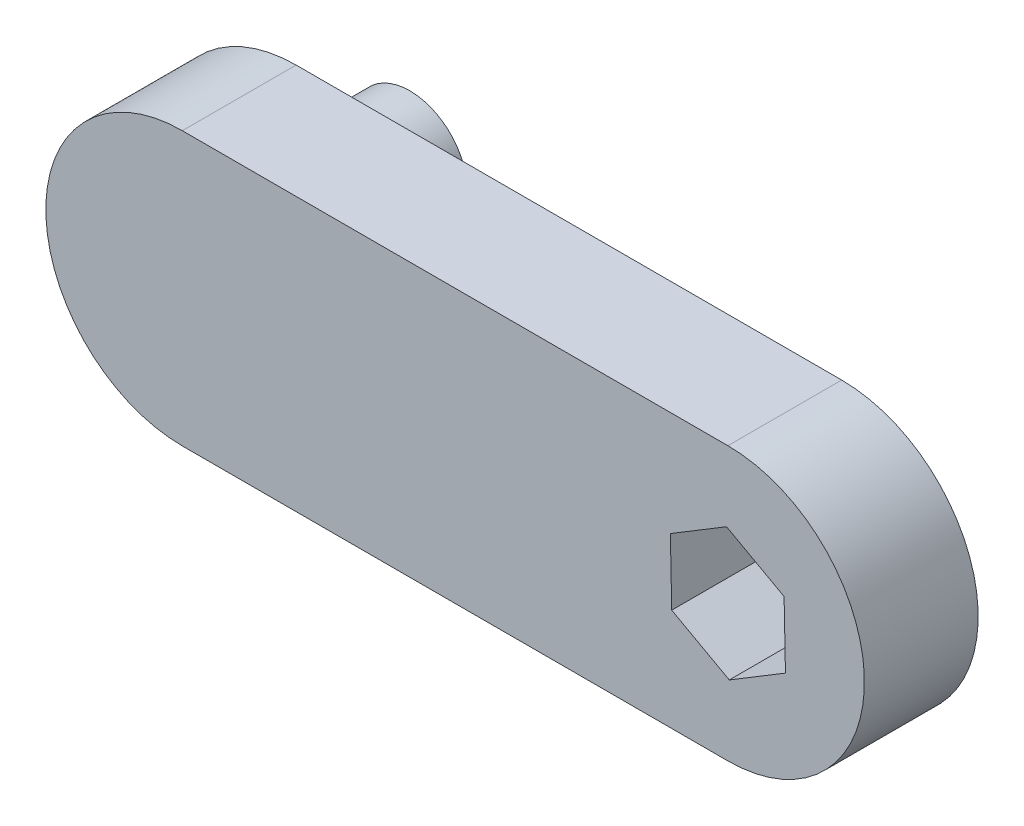
ISO-10303-21;
HEADER;
FILE_DESCRIPTION(('STEP AP214'),'2;1');
FILE_NAME('part.step','',(''),(''),'','','');
FILE_SCHEMA(('AUTOMOTIVE_DESIGN { 1 0 10303 214 1 1 1 1 }'));
ENDSEC;
DATA;
#1=APPLICATION_CONTEXT('core data for automotive mechanical design processes');
#2=APPLICATION_PROTOCOL_DEFINITION('international standard','automotive_design',2000,#1);
#3=PRODUCT_CONTEXT('',#1,'mechanical');
#4=PRODUCT('Part','Part','',(#3));
#5=PRODUCT_RELATED_PRODUCT_CATEGORY('part','',(#4));
#6=PRODUCT_DEFINITION_FORMATION('','',#4);
#7=PRODUCT_DEFINITION_CONTEXT('part definition',#1,'design');
#8=PRODUCT_DEFINITION('design','',#6,#7);
#9=PRODUCT_DEFINITION_SHAPE('','',#8);
#10=(LENGTH_UNIT() NAMED_UNIT(*) SI_UNIT(.MILLI.,.METRE.));
#11=(NAMED_UNIT(*) PLANE_ANGLE_UNIT() SI_UNIT($,.RADIAN.));
#12=(NAMED_UNIT(*) SI_UNIT($,.STERADIAN.) SOLID_ANGLE_UNIT());
#13=UNCERTAINTY_MEASURE_WITH_UNIT(LENGTH_MEASURE(1.E-05),#10,'distance_accuracy_value','');
#14=(GEOMETRIC_REPRESENTATION_CONTEXT(3) GLOBAL_UNCERTAINTY_ASSIGNED_CONTEXT((#13)) GLOBAL_UNIT_ASSIGNED_CONTEXT((#10,
#11,#12)) REPRESENTATION_CONTEXT('',''));
#15=CARTESIAN_POINT('',(0.,0.,0.));
#16=DIRECTION('',(0.,0.,1.));
#17=DIRECTION('',(1.,0.,0.));
#18=AXIS2_PLACEMENT_3D('',#15,#16,#17);
#19=CARTESIAN_POINT('',(0.,0.,5.));
#20=DIRECTION('',(0.,0.,1.));
#21=DIRECTION('',(1.,0.,0.));
#22=AXIS2_PLACEMENT_3D('',#19,#20,#21);
#23=PLANE('',#22);
#24=CARTESIAN_POINT('',(0.,0.,5.));
#25=DIRECTION('',(0.,0.,1.));
#26=DIRECTION('',(1.,0.,0.));
#27=AXIS2_PLACEMENT_3D('',#24,#25,#26);
#28=CIRCLE('',#27,6.);
#29=CARTESIAN_POINT('',(0.,6.,5.));
#30=VERTEX_POINT('',#29);
#31=CARTESIAN_POINT('',(0.,-6.,5.));
#32=VERTEX_POINT('',#31);
#33=EDGE_CURVE('E171',#30,#32,#28,.T.);
#34=ORIENTED_EDGE('',*,*,#33,.T.);
#35=DIRECTION('',(1.,0.,0.));
#36=VECTOR('',#35,1.);
#37=CARTESIAN_POINT('',(0.,-6.,5.));
#38=LINE('',#37,#36);
#39=CARTESIAN_POINT('',(23.9795710433265,-6.,5.));
#40=VERTEX_POINT('',#39);
#41=EDGE_CURVE('E174',#32,#40,#38,.T.);
#42=ORIENTED_EDGE('',*,*,#41,.T.);
#43=CARTESIAN_POINT('',(23.9795710433265,0.,5.));
#44=DIRECTION('',(0.,0.,1.));
#45=DIRECTION('',(1.,0.,0.));
#46=AXIS2_PLACEMENT_3D('',#43,#44,#45);
#47=CIRCLE('',#46,6.);
#48=CARTESIAN_POINT('',(23.9795710433265,6.,5.));
#49=VERTEX_POINT('',#48);
#50=EDGE_CURVE('E177',#40,#49,#47,.T.);
#51=ORIENTED_EDGE('',*,*,#50,.T.);
#52=DIRECTION('',(-1.,0.,0.));
#53=VECTOR('',#52,1.);
#54=CARTESIAN_POINT('',(0.,6.,5.));
#55=LINE('',#54,#53);
#56=EDGE_CURVE('E179',#49,#30,#55,.T.);
#57=ORIENTED_EDGE('',*,*,#56,.T.);
#58=EDGE_LOOP('',(#34,#42,#51,#57));
#59=FACE_BOUND('',#58,.T.);
#60=DIRECTION('',(-0.0207568435449829,0.999784553514431,0.));
#61=VECTOR('',#60,1.);
#62=CARTESIAN_POINT('',(26.5089923501331,-1.39117259389551,5.));
#63=LINE('',#62,#61);
#64=CARTESIAN_POINT('',(26.5089923501331,-1.39117259389551,5.));
#65=VERTEX_POINT('',#64);
#66=CARTESIAN_POINT('',(26.449072504092,1.49495681162043,5.));
#67=VERTEX_POINT('',#66);
#68=EDGE_CURVE('E126',#65,#67,#63,.T.);
#69=ORIENTED_EDGE('',*,*,#68,.F.);
#70=DIRECTION('',(0.855460399882288,0.517868230569549,0.));
#71=VECTOR('',#70,1.);
#72=CARTESIAN_POINT('',(24.0394908893676,-2.88612940551593,5.));
#73=LINE('',#72,#71);
#74=CARTESIAN_POINT('',(24.0394908893676,-2.88612940551593,5.));
#75=VERTEX_POINT('',#74);
#76=EDGE_CURVE('E118',#75,#65,#73,.T.);
#77=ORIENTED_EDGE('',*,*,#76,.F.);
#78=DIRECTION('',(0.87621724342727,-0.481916322944882,0.));
#79=VECTOR('',#78,1.);
#80=CARTESIAN_POINT('',(21.510069582561,-1.49495681162042,5.));
#81=LINE('',#80,#79);
#82=CARTESIAN_POINT('',(21.510069582561,-1.49495681162042,5.));
#83=VERTEX_POINT('',#82);
#84=EDGE_CURVE('E148',#83,#75,#81,.T.);
#85=ORIENTED_EDGE('',*,*,#84,.F.);
#86=DIRECTION('',(0.0207568435449829,-0.99978455351443,0.));
#87=VECTOR('',#86,1.);
#88=CARTESIAN_POINT('',(21.4501497365199,1.39117259389551,5.));
#89=LINE('',#88,#87);
#90=CARTESIAN_POINT('',(21.4501497365199,1.39117259389551,5.));
#91=VERTEX_POINT('',#90);
#92=EDGE_CURVE('E146',#91,#83,#89,.T.);
#93=ORIENTED_EDGE('',*,*,#92,.F.);
#94=DIRECTION('',(-0.855460399882288,-0.517868230569549,0.));
#95=VECTOR('',#94,1.);
#96=CARTESIAN_POINT('',(23.9196511972854,2.88612940551593,5.));
#97=LINE('',#96,#95);
#98=CARTESIAN_POINT('',(23.9196511972854,2.88612940551593,5.));
#99=VERTEX_POINT('',#98);
#100=EDGE_CURVE('E141',#99,#91,#97,.T.);
#101=ORIENTED_EDGE('',*,*,#100,.F.);
#102=DIRECTION('',(-0.87621724342727,0.481916322944881,0.));
#103=VECTOR('',#102,1.);
#104=CARTESIAN_POINT('',(26.449072504092,1.49495681162043,5.));
#105=LINE('',#104,#103);
#106=EDGE_CURVE('E139',#67,#99,#105,.T.);
#107=ORIENTED_EDGE('',*,*,#106,.F.);
#108=EDGE_LOOP('',(#69,#77,#85,#93,#101,#107));
#109=FACE_BOUND('',#108,.T.);
#110=ADVANCED_FACE('F41',(#59,#109),#23,.T.);
#111=CARTESIAN_POINT('',(0.,0.,0.));
#112=DIRECTION('',(0.,0.,1.));
#113=DIRECTION('',(1.,0.,0.));
#114=AXIS2_PLACEMENT_3D('',#111,#112,#113);
#115=PLANE('',#114);
#116=CARTESIAN_POINT('',(0.,0.,0.));
#117=DIRECTION('',(0.,0.,1.));
#118=DIRECTION('',(1.,0.,0.));
#119=AXIS2_PLACEMENT_3D('',#116,#117,#118);
#120=CIRCLE('',#119,2.52);
#121=CARTESIAN_POINT('',(2.52,0.,0.));
#122=VERTEX_POINT('',#121);
#123=EDGE_CURVE('E11',#122,#122,#120,.F.);
#124=ORIENTED_EDGE('',*,*,#123,.F.);
#125=EDGE_LOOP('',(#124));
#126=FACE_BOUND('',#125,.T.);
#127=CARTESIAN_POINT('',(0.,0.,0.));
#128=DIRECTION('',(0.,0.,1.));
#129=DIRECTION('',(1.,0.,0.));
#130=AXIS2_PLACEMENT_3D('',#127,#128,#129);
#131=CIRCLE('',#130,6.);
#132=CARTESIAN_POINT('',(0.,6.,0.));
#133=VERTEX_POINT('',#132);
#134=CARTESIAN_POINT('',(0.,-6.,0.));
#135=VERTEX_POINT('',#134);
#136=EDGE_CURVE('E134',#133,#135,#131,.T.);
#137=ORIENTED_EDGE('',*,*,#136,.F.);
#138=DIRECTION('',(-1.,0.,0.));
#139=VECTOR('',#138,1.);
#140=CARTESIAN_POINT('',(0.,6.,0.));
#141=LINE('',#140,#139);
#142=CARTESIAN_POINT('',(23.9795710433265,6.,0.));
#143=VERTEX_POINT('',#142);
#144=EDGE_CURVE('E175',#143,#133,#141,.T.);
#145=ORIENTED_EDGE('',*,*,#144,.F.);
#146=CARTESIAN_POINT('',(23.9795710433265,0.,0.));
#147=DIRECTION('',(0.,0.,1.));
#148=DIRECTION('',(1.,0.,0.));
#149=AXIS2_PLACEMENT_3D('',#146,#147,#148);
#150=CIRCLE('',#149,6.);
#151=CARTESIAN_POINT('',(23.9795710433265,-6.,0.));
#152=VERTEX_POINT('',#151);
#153=EDGE_CURVE('E186',#152,#143,#150,.T.);
#154=ORIENTED_EDGE('',*,*,#153,.F.);
#155=DIRECTION('',(1.,0.,0.));
#156=VECTOR('',#155,1.);
#157=CARTESIAN_POINT('',(0.,-6.,0.));
#158=LINE('',#157,#156);
#159=EDGE_CURVE('E184',#135,#152,#158,.T.);
#160=ORIENTED_EDGE('',*,*,#159,.F.);
#161=EDGE_LOOP('',(#137,#145,#154,#160));
#162=FACE_BOUND('',#161,.T.);
#163=DIRECTION('',(0.855460399882288,0.517868230569549,0.));
#164=VECTOR('',#163,1.);
#165=CARTESIAN_POINT('',(24.0394908893676,-2.88612940551593,0.));
#166=LINE('',#165,#164);
#167=CARTESIAN_POINT('',(24.0394908893676,-2.88612940551593,0.));
#168=VERTEX_POINT('',#167);
#169=CARTESIAN_POINT('',(26.5089923501331,-1.39117259389551,0.));
#170=VERTEX_POINT('',#169);
#171=EDGE_CURVE('E64',#168,#170,#166,.T.);
#172=ORIENTED_EDGE('',*,*,#171,.T.);
#173=DIRECTION('',(-0.0207568435449829,0.999784553514431,0.));
#174=VECTOR('',#173,1.);
#175=CARTESIAN_POINT('',(26.5089923501331,-1.39117259389551,0.));
#176=LINE('',#175,#174);
#177=CARTESIAN_POINT('',(26.449072504092,1.49495681162043,0.));
#178=VERTEX_POINT('',#177);
#179=EDGE_CURVE('E133',#170,#178,#176,.T.);
#180=ORIENTED_EDGE('',*,*,#179,.T.);
#181=DIRECTION('',(-0.87621724342727,0.481916322944881,0.));
#182=VECTOR('',#181,1.);
#183=CARTESIAN_POINT('',(26.449072504092,1.49495681162043,0.));
#184=LINE('',#183,#182);
#185=CARTESIAN_POINT('',(23.9196511972854,2.88612940551593,0.));
#186=VERTEX_POINT('',#185);
#187=EDGE_CURVE('E153',#178,#186,#184,.T.);
#188=ORIENTED_EDGE('',*,*,#187,.T.);
#189=DIRECTION('',(-0.855460399882288,-0.517868230569549,0.));
#190=VECTOR('',#189,1.);
#191=CARTESIAN_POINT('',(23.9196511972854,2.88612940551593,0.));
#192=LINE('',#191,#190);
#193=CARTESIAN_POINT('',(21.4501497365199,1.39117259389551,0.));
#194=VERTEX_POINT('',#193);
#195=EDGE_CURVE('E156',#186,#194,#192,.T.);
#196=ORIENTED_EDGE('',*,*,#195,.T.);
#197=DIRECTION('',(0.0207568435449829,-0.99978455351443,0.));
#198=VECTOR('',#197,1.);
#199=CARTESIAN_POINT('',(21.4501497365199,1.39117259389551,0.));
#200=LINE('',#199,#198);
#201=CARTESIAN_POINT('',(21.510069582561,-1.49495681162042,0.));
#202=VERTEX_POINT('',#201);
#203=EDGE_CURVE('E159',#194,#202,#200,.T.);
#204=ORIENTED_EDGE('',*,*,#203,.T.);
#205=DIRECTION('',(0.87621724342727,-0.481916322944882,0.));
#206=VECTOR('',#205,1.);
#207=CARTESIAN_POINT('',(21.510069582561,-1.49495681162042,0.));
#208=LINE('',#207,#206);
#209=EDGE_CURVE('E127',#202,#168,#208,.T.);
#210=ORIENTED_EDGE('',*,*,#209,.T.);
#211=EDGE_LOOP('',(#172,#180,#188,#196,#204,#210));
#212=FACE_BOUND('',#211,.T.);
#213=ADVANCED_FACE('F207',(#126,#162,#212),#115,.F.);
#214=CARTESIAN_POINT('',(0.,0.,5.));
#215=DIRECTION('',(0.,0.,-1.));
#216=DIRECTION('',(-1.,0.,0.));
#217=AXIS2_PLACEMENT_3D('',#214,#215,#216);
#218=CYLINDRICAL_SURFACE('',#217,6.);
#219=ORIENTED_EDGE('',*,*,#136,.T.);
#220=DIRECTION('',(0.,0.,-1.));
#221=VECTOR('',#220,1.);
#222=CARTESIAN_POINT('',(0.,-6.,5.));
#223=LINE('',#222,#221);
#224=EDGE_CURVE('E49',#32,#135,#223,.T.);
#225=ORIENTED_EDGE('',*,*,#224,.F.);
#226=ORIENTED_EDGE('',*,*,#33,.F.);
#227=DIRECTION('',(0.,0.,-1.));
#228=VECTOR('',#227,1.);
#229=CARTESIAN_POINT('',(0.,6.,5.));
#230=LINE('',#229,#228);
#231=EDGE_CURVE('E181',#30,#133,#230,.T.);
#232=ORIENTED_EDGE('',*,*,#231,.T.);
#233=EDGE_LOOP('',(#219,#225,#226,#232));
#234=FACE_BOUND('',#233,.T.);
#235=ADVANCED_FACE('F43',(#234),#218,.T.);
#236=CARTESIAN_POINT('',(0.,-6.,5.));
#237=DIRECTION('',(0.,1.,0.));
#238=DIRECTION('',(0.,0.,1.));
#239=AXIS2_PLACEMENT_3D('',#236,#237,#238);
#240=PLANE('',#239);
#241=ORIENTED_EDGE('',*,*,#159,.T.);
#242=DIRECTION('',(0.,0.,-1.));
#243=VECTOR('',#242,1.);
#244=CARTESIAN_POINT('',(23.9795710433265,-6.,5.));
#245=LINE('',#244,#243);
#246=EDGE_CURVE('E194',#40,#152,#245,.T.);
#247=ORIENTED_EDGE('',*,*,#246,.F.);
#248=ORIENTED_EDGE('',*,*,#41,.F.);
#249=ORIENTED_EDGE('',*,*,#224,.T.);
#250=EDGE_LOOP('',(#241,#247,#248,#249));
#251=FACE_BOUND('',#250,.T.);
#252=ADVANCED_FACE('F199',(#251),#240,.F.);
#253=CARTESIAN_POINT('',(23.9795710433265,0.,5.));
#254=DIRECTION('',(0.,0.,-1.));
#255=DIRECTION('',(-1.,0.,0.));
#256=AXIS2_PLACEMENT_3D('',#253,#254,#255);
#257=CYLINDRICAL_SURFACE('',#256,6.);
#258=ORIENTED_EDGE('',*,*,#153,.T.);
#259=DIRECTION('',(0.,0.,-1.));
#260=VECTOR('',#259,1.);
#261=CARTESIAN_POINT('',(23.9795710433265,6.,5.));
#262=LINE('',#261,#260);
#263=EDGE_CURVE('E191',#49,#143,#262,.T.);
#264=ORIENTED_EDGE('',*,*,#263,.F.);
#265=ORIENTED_EDGE('',*,*,#50,.F.);
#266=ORIENTED_EDGE('',*,*,#246,.T.);
#267=EDGE_LOOP('',(#258,#264,#265,#266));
#268=FACE_BOUND('',#267,.T.);
#269=ADVANCED_FACE('F212',(#268),#257,.T.);
#270=CARTESIAN_POINT('',(0.,6.,5.));
#271=DIRECTION('',(0.,-1.,0.));
#272=DIRECTION('',(0.,0.,-1.));
#273=AXIS2_PLACEMENT_3D('',#270,#271,#272);
#274=PLANE('',#273);
#275=ORIENTED_EDGE('',*,*,#144,.T.);
#276=ORIENTED_EDGE('',*,*,#231,.F.);
#277=ORIENTED_EDGE('',*,*,#56,.F.);
#278=ORIENTED_EDGE('',*,*,#263,.T.);
#279=EDGE_LOOP('',(#275,#276,#277,#278));
#280=FACE_BOUND('',#279,.T.);
#281=ADVANCED_FACE('F216',(#280),#274,.F.);
#282=CARTESIAN_POINT('',(24.0394908893676,-2.88612940551593,5.));
#283=DIRECTION('',(-0.517868230569549,0.855460399882288,0.));
#284=DIRECTION('',(-0.855460399882288,-0.517868230569549,0.));
#285=AXIS2_PLACEMENT_3D('',#282,#283,#284);
#286=PLANE('',#285);
#287=ORIENTED_EDGE('',*,*,#171,.F.);
#288=DIRECTION('',(0.,0.,-1.));
#289=VECTOR('',#288,1.);
#290=CARTESIAN_POINT('',(24.0394908893676,-2.88612940551593,5.));
#291=LINE('',#290,#289);
#292=EDGE_CURVE('E122',#75,#168,#291,.T.);
#293=ORIENTED_EDGE('',*,*,#292,.F.);
#294=ORIENTED_EDGE('',*,*,#76,.T.);
#295=DIRECTION('',(0.,0.,-1.));
#296=VECTOR('',#295,1.);
#297=CARTESIAN_POINT('',(26.5089923501331,-1.39117259389551,5.));
#298=LINE('',#297,#296);
#299=EDGE_CURVE('E121',#65,#170,#298,.T.);
#300=ORIENTED_EDGE('',*,*,#299,.T.);
#301=EDGE_LOOP('',(#287,#293,#294,#300));
#302=FACE_BOUND('',#301,.T.);
#303=ADVANCED_FACE('F120',(#302),#286,.T.);
#304=CARTESIAN_POINT('',(26.5089923501331,-1.39117259389551,5.));
#305=DIRECTION('',(-0.999784553514431,-0.0207568435449829,0.));
#306=DIRECTION('',(0.0207568435449829,-0.999784553514431,0.));
#307=AXIS2_PLACEMENT_3D('',#304,#305,#306);
#308=PLANE('',#307);
#309=ORIENTED_EDGE('',*,*,#179,.F.);
#310=ORIENTED_EDGE('',*,*,#299,.F.);
#311=ORIENTED_EDGE('',*,*,#68,.T.);
#312=DIRECTION('',(0.,0.,-1.));
#313=VECTOR('',#312,1.);
#314=CARTESIAN_POINT('',(26.449072504092,1.49495681162043,5.));
#315=LINE('',#314,#313);
#316=EDGE_CURVE('E135',#67,#178,#315,.T.);
#317=ORIENTED_EDGE('',*,*,#316,.T.);
#318=EDGE_LOOP('',(#309,#310,#311,#317));
#319=FACE_BOUND('',#318,.T.);
#320=ADVANCED_FACE('F130',(#319),#308,.T.);
#321=CARTESIAN_POINT('',(26.449072504092,1.49495681162043,5.));
#322=DIRECTION('',(-0.481916322944882,-0.876217243427271,0.));
#323=DIRECTION('',(0.876217243427271,-0.481916322944882,0.));
#324=AXIS2_PLACEMENT_3D('',#321,#322,#323);
#325=PLANE('',#324);
#326=ORIENTED_EDGE('',*,*,#187,.F.);
#327=ORIENTED_EDGE('',*,*,#316,.F.);
#328=ORIENTED_EDGE('',*,*,#106,.T.);
#329=DIRECTION('',(0.,0.,-1.));
#330=VECTOR('',#329,1.);
#331=CARTESIAN_POINT('',(23.9196511972854,2.88612940551593,5.));
#332=LINE('',#331,#330);
#333=EDGE_CURVE('E168',#99,#186,#332,.T.);
#334=ORIENTED_EDGE('',*,*,#333,.T.);
#335=EDGE_LOOP('',(#326,#327,#328,#334));
#336=FACE_BOUND('',#335,.T.);
#337=ADVANCED_FACE('F274',(#336),#325,.T.);
#338=CARTESIAN_POINT('',(23.9196511972854,2.88612940551593,5.));
#339=DIRECTION('',(0.517868230569549,-0.855460399882289,0.));
#340=DIRECTION('',(0.855460399882289,0.517868230569549,0.));
#341=AXIS2_PLACEMENT_3D('',#338,#339,#340);
#342=PLANE('',#341);
#343=ORIENTED_EDGE('',*,*,#195,.F.);
#344=ORIENTED_EDGE('',*,*,#333,.F.);
#345=ORIENTED_EDGE('',*,*,#100,.T.);
#346=DIRECTION('',(0.,0.,-1.));
#347=VECTOR('',#346,1.);
#348=CARTESIAN_POINT('',(21.4501497365199,1.39117259389551,5.));
#349=LINE('',#348,#347);
#350=EDGE_CURVE('E166',#91,#194,#349,.T.);
#351=ORIENTED_EDGE('',*,*,#350,.T.);
#352=EDGE_LOOP('',(#343,#344,#345,#351));
#353=FACE_BOUND('',#352,.T.);
#354=ADVANCED_FACE('F282',(#353),#342,.T.);
#355=CARTESIAN_POINT('',(21.4501497365199,1.39117259389551,5.));
#356=DIRECTION('',(0.99978455351443,0.0207568435449829,0.));
#357=DIRECTION('',(-0.0207568435449829,0.999784553514431,0.));
#358=AXIS2_PLACEMENT_3D('',#355,#356,#357);
#359=PLANE('',#358);
#360=ORIENTED_EDGE('',*,*,#203,.F.);
#361=ORIENTED_EDGE('',*,*,#350,.F.);
#362=ORIENTED_EDGE('',*,*,#92,.T.);
#363=DIRECTION('',(0.,0.,-1.));
#364=VECTOR('',#363,1.);
#365=CARTESIAN_POINT('',(21.510069582561,-1.49495681162042,5.));
#366=LINE('',#365,#364);
#367=EDGE_CURVE('E56',#83,#202,#366,.T.);
#368=ORIENTED_EDGE('',*,*,#367,.T.);
#369=EDGE_LOOP('',(#360,#361,#362,#368));
#370=FACE_BOUND('',#369,.T.);
#371=ADVANCED_FACE('F292',(#370),#359,.T.);
#372=CARTESIAN_POINT('',(21.510069582561,-1.49495681162042,5.));
#373=DIRECTION('',(0.481916322944882,0.87621724342727,0.));
#374=DIRECTION('',(-0.87621724342727,0.481916322944882,0.));
#375=AXIS2_PLACEMENT_3D('',#372,#373,#374);
#376=PLANE('',#375);
#377=ORIENTED_EDGE('',*,*,#209,.F.);
#378=ORIENTED_EDGE('',*,*,#367,.F.);
#379=ORIENTED_EDGE('',*,*,#84,.T.);
#380=ORIENTED_EDGE('',*,*,#292,.T.);
#381=EDGE_LOOP('',(#377,#378,#379,#380));
#382=FACE_BOUND('',#381,.T.);
#383=ADVANCED_FACE('F302',(#382),#376,.T.);
#384=CARTESIAN_POINT('',(0.,0.,-5.));
#385=DIRECTION('',(0.,0.,1.));
#386=DIRECTION('',(1.,0.,0.));
#387=AXIS2_PLACEMENT_3D('',#384,#385,#386);
#388=CYLINDRICAL_SURFACE('',#387,2.52);
#389=CARTESIAN_POINT('',(0.,0.,-5.));
#390=DIRECTION('',(0.,0.,-1.));
#391=DIRECTION('',(-1.,0.,0.));
#392=AXIS2_PLACEMENT_3D('',#389,#390,#391);
#393=CIRCLE('',#392,2.52);
#394=CARTESIAN_POINT('',(-2.52,0.,-5.));
#395=VERTEX_POINT('',#394);
#396=EDGE_CURVE('E151',#395,#395,#393,.T.);
#397=ORIENTED_EDGE('',*,*,#396,.F.);
#398=EDGE_LOOP('',(#397));
#399=FACE_BOUND('',#398,.T.);
#400=ORIENTED_EDGE('',*,*,#123,.T.);
#401=EDGE_LOOP('',(#400));
#402=FACE_BOUND('',#401,.T.);
#403=ADVANCED_FACE('F312',(#399,#402),#388,.T.);
#404=CARTESIAN_POINT('',(0.,0.,-5.));
#405=DIRECTION('',(0.,0.,-1.));
#406=DIRECTION('',(-1.,0.,0.));
#407=AXIS2_PLACEMENT_3D('',#404,#405,#406);
#408=PLANE('',#407);
#409=ORIENTED_EDGE('',*,*,#396,.T.);
#410=EDGE_LOOP('',(#409));
#411=FACE_BOUND('',#410,.T.);
#412=ADVANCED_FACE('F321',(#411),#408,.T.);
#413=CLOSED_SHELL('',(#110,#213,#235,#252,#269,#281,#303,#320,#337,#354,#371,#383,#403,#412));
#414=MANIFOLD_SOLID_BREP('B2',#413);
#415=ADVANCED_BREP_SHAPE_REPRESENTATION('',(#18,#414),#14);
#416=SHAPE_DEFINITION_REPRESENTATION(#9,#415);
ENDSEC;
END-ISO-10303-21;
